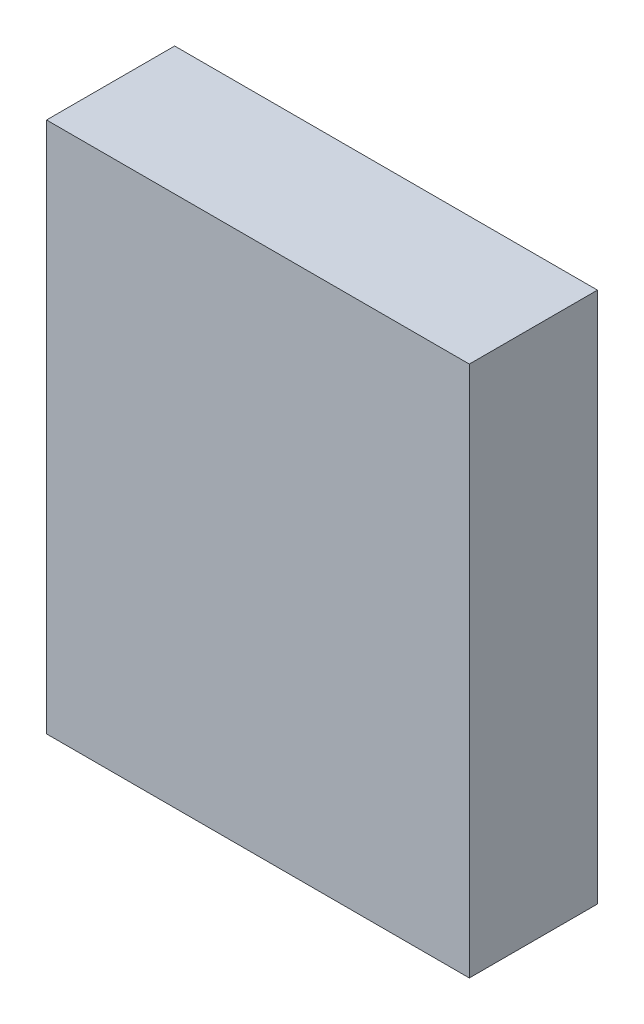
ISO-10303-21;
HEADER;
FILE_DESCRIPTION(('STEP AP214'),'2;1');
FILE_NAME('part.step','',(''),(''),'','','');
FILE_SCHEMA(('AUTOMOTIVE_DESIGN { 1 0 10303 214 1 1 1 1 }'));
ENDSEC;
DATA;
#1=APPLICATION_CONTEXT('core data for automotive mechanical design processes');
#2=APPLICATION_PROTOCOL_DEFINITION('international standard','automotive_design',2000,#1);
#3=PRODUCT_CONTEXT('',#1,'mechanical');
#4=PRODUCT('Part','Part','',(#3));
#5=PRODUCT_RELATED_PRODUCT_CATEGORY('part','',(#4));
#6=PRODUCT_DEFINITION_FORMATION('','',#4);
#7=PRODUCT_DEFINITION_CONTEXT('part definition',#1,'design');
#8=PRODUCT_DEFINITION('design','',#6,#7);
#9=PRODUCT_DEFINITION_SHAPE('','',#8);
#10=(LENGTH_UNIT() NAMED_UNIT(*) SI_UNIT(.MILLI.,.METRE.));
#11=(NAMED_UNIT(*) PLANE_ANGLE_UNIT() SI_UNIT($,.RADIAN.));
#12=(NAMED_UNIT(*) SI_UNIT($,.STERADIAN.) SOLID_ANGLE_UNIT());
#13=UNCERTAINTY_MEASURE_WITH_UNIT(LENGTH_MEASURE(1.E-05),#10,'distance_accuracy_value','');
#14=(GEOMETRIC_REPRESENTATION_CONTEXT(3) GLOBAL_UNCERTAINTY_ASSIGNED_CONTEXT((#13)) GLOBAL_UNIT_ASSIGNED_CONTEXT((#10,
#11,#12)) REPRESENTATION_CONTEXT('',''));
#15=CARTESIAN_POINT('',(0.,0.,0.));
#16=DIRECTION('',(0.,0.,1.));
#17=DIRECTION('',(1.,0.,0.));
#18=AXIS2_PLACEMENT_3D('',#15,#16,#17);
#19=CARTESIAN_POINT('',(0.,0.,2.));
#20=DIRECTION('',(0.,0.,1.));
#21=DIRECTION('',(1.,0.,0.));
#22=AXIS2_PLACEMENT_3D('',#19,#20,#21);
#23=PLANE('',#22);
#24=DIRECTION('',(0.,1.,0.));
#25=VECTOR('',#24,1.);
#26=CARTESIAN_POINT('',(0.,0.,2.));
#27=LINE('',#26,#25);
#28=CARTESIAN_POINT('',(0.,0.,2.));
#29=VERTEX_POINT('',#28);
#30=CARTESIAN_POINT('',(0.,8.3,2.));
#31=VERTEX_POINT('',#30);
#32=EDGE_CURVE('E90',#29,#31,#27,.T.);
#33=ORIENTED_EDGE('',*,*,#32,.F.);
#34=DIRECTION('',(1.,0.,0.));
#35=VECTOR('',#34,1.);
#36=CARTESIAN_POINT('',(0.,0.,2.));
#37=LINE('',#36,#35);
#38=CARTESIAN_POINT('',(6.6,0.,2.));
#39=VERTEX_POINT('',#38);
#40=EDGE_CURVE('E75',#29,#39,#37,.T.);
#41=ORIENTED_EDGE('',*,*,#40,.T.);
#42=DIRECTION('',(0.,1.,0.));
#43=VECTOR('',#42,1.);
#44=CARTESIAN_POINT('',(6.6,0.,2.));
#45=LINE('',#44,#43);
#46=CARTESIAN_POINT('',(6.6,8.3,2.));
#47=VERTEX_POINT('',#46);
#48=EDGE_CURVE('E83',#39,#47,#45,.T.);
#49=ORIENTED_EDGE('',*,*,#48,.T.);
#50=DIRECTION('',(1.,0.,0.));
#51=VECTOR('',#50,1.);
#52=CARTESIAN_POINT('',(0.,8.3,2.));
#53=LINE('',#52,#51);
#54=EDGE_CURVE('E11',#31,#47,#53,.T.);
#55=ORIENTED_EDGE('',*,*,#54,.F.);
#56=EDGE_LOOP('',(#33,#41,#49,#55));
#57=FACE_BOUND('',#56,.T.);
#58=ADVANCED_FACE('F17',(#57),#23,.T.);
#59=CARTESIAN_POINT('',(0.,0.,0.));
#60=DIRECTION('',(0.,0.,1.));
#61=DIRECTION('',(1.,0.,0.));
#62=AXIS2_PLACEMENT_3D('',#59,#60,#61);
#63=PLANE('',#62);
#64=DIRECTION('',(1.,0.,0.));
#65=VECTOR('',#64,1.);
#66=CARTESIAN_POINT('',(0.,8.3,0.));
#67=LINE('',#66,#65);
#68=CARTESIAN_POINT('',(0.,8.3,0.));
#69=VERTEX_POINT('',#68);
#70=CARTESIAN_POINT('',(6.6,8.3,0.));
#71=VERTEX_POINT('',#70);
#72=EDGE_CURVE('E27',#69,#71,#67,.T.);
#73=ORIENTED_EDGE('',*,*,#72,.T.);
#74=DIRECTION('',(0.,1.,0.));
#75=VECTOR('',#74,1.);
#76=CARTESIAN_POINT('',(6.6,0.,0.));
#77=LINE('',#76,#75);
#78=CARTESIAN_POINT('',(6.6,0.,0.));
#79=VERTEX_POINT('',#78);
#80=EDGE_CURVE('E110',#79,#71,#77,.T.);
#81=ORIENTED_EDGE('',*,*,#80,.F.);
#82=DIRECTION('',(1.,0.,0.));
#83=VECTOR('',#82,1.);
#84=CARTESIAN_POINT('',(0.,0.,0.));
#85=LINE('',#84,#83);
#86=CARTESIAN_POINT('',(0.,0.,0.));
#87=VERTEX_POINT('',#86);
#88=EDGE_CURVE('E85',#87,#79,#85,.T.);
#89=ORIENTED_EDGE('',*,*,#88,.F.);
#90=DIRECTION('',(0.,1.,0.));
#91=VECTOR('',#90,1.);
#92=CARTESIAN_POINT('',(0.,0.,0.));
#93=LINE('',#92,#91);
#94=EDGE_CURVE('E89',#87,#69,#93,.T.);
#95=ORIENTED_EDGE('',*,*,#94,.T.);
#96=EDGE_LOOP('',(#73,#81,#89,#95));
#97=FACE_BOUND('',#96,.T.);
#98=ADVANCED_FACE('F19',(#97),#63,.F.);
#99=CARTESIAN_POINT('',(0.,8.3,0.));
#100=DIRECTION('',(0.,1.,0.));
#101=DIRECTION('',(1.,0.,0.));
#102=AXIS2_PLACEMENT_3D('',#99,#100,#101);
#103=PLANE('',#102);
#104=ORIENTED_EDGE('',*,*,#72,.F.);
#105=DIRECTION('',(0.,0.,1.));
#106=VECTOR('',#105,1.);
#107=CARTESIAN_POINT('',(0.,8.3,0.));
#108=LINE('',#107,#106);
#109=EDGE_CURVE('E94',#69,#31,#108,.T.);
#110=ORIENTED_EDGE('',*,*,#109,.T.);
#111=ORIENTED_EDGE('',*,*,#54,.T.);
#112=DIRECTION('',(0.,0.,1.));
#113=VECTOR('',#112,1.);
#114=CARTESIAN_POINT('',(6.6,8.3,0.));
#115=LINE('',#114,#113);
#116=EDGE_CURVE('E101',#71,#47,#115,.T.);
#117=ORIENTED_EDGE('',*,*,#116,.F.);
#118=EDGE_LOOP('',(#104,#110,#111,#117));
#119=FACE_BOUND('',#118,.T.);
#120=ADVANCED_FACE('F118',(#119),#103,.T.);
#121=CARTESIAN_POINT('',(0.,0.,0.));
#122=DIRECTION('',(0.,1.,0.));
#123=DIRECTION('',(1.,0.,0.));
#124=AXIS2_PLACEMENT_3D('',#121,#122,#123);
#125=PLANE('',#124);
#126=DIRECTION('',(0.,0.,1.));
#127=VECTOR('',#126,1.);
#128=CARTESIAN_POINT('',(6.6,0.,0.));
#129=LINE('',#128,#127);
#130=EDGE_CURVE('E80',#79,#39,#129,.T.);
#131=ORIENTED_EDGE('',*,*,#130,.T.);
#132=ORIENTED_EDGE('',*,*,#40,.F.);
#133=DIRECTION('',(0.,0.,1.));
#134=VECTOR('',#133,1.);
#135=CARTESIAN_POINT('',(0.,0.,0.));
#136=LINE('',#135,#134);
#137=EDGE_CURVE('E72',#87,#29,#136,.T.);
#138=ORIENTED_EDGE('',*,*,#137,.F.);
#139=ORIENTED_EDGE('',*,*,#88,.T.);
#140=EDGE_LOOP('',(#131,#132,#138,#139));
#141=FACE_BOUND('',#140,.T.);
#142=ADVANCED_FACE('F73',(#141),#125,.F.);
#143=CARTESIAN_POINT('',(6.6,0.,0.));
#144=DIRECTION('',(1.,0.,0.));
#145=DIRECTION('',(0.,1.,0.));
#146=AXIS2_PLACEMENT_3D('',#143,#144,#145);
#147=PLANE('',#146);
#148=ORIENTED_EDGE('',*,*,#130,.F.);
#149=ORIENTED_EDGE('',*,*,#80,.T.);
#150=ORIENTED_EDGE('',*,*,#116,.T.);
#151=ORIENTED_EDGE('',*,*,#48,.F.);
#152=EDGE_LOOP('',(#148,#149,#150,#151));
#153=FACE_BOUND('',#152,.T.);
#154=ADVANCED_FACE('F119',(#153),#147,.T.);
#155=CARTESIAN_POINT('',(0.,0.,0.));
#156=DIRECTION('',(1.,0.,0.));
#157=DIRECTION('',(0.,1.,0.));
#158=AXIS2_PLACEMENT_3D('',#155,#156,#157);
#159=PLANE('',#158);
#160=ORIENTED_EDGE('',*,*,#32,.T.);
#161=ORIENTED_EDGE('',*,*,#109,.F.);
#162=ORIENTED_EDGE('',*,*,#94,.F.);
#163=ORIENTED_EDGE('',*,*,#137,.T.);
#164=EDGE_LOOP('',(#160,#161,#162,#163));
#165=FACE_BOUND('',#164,.T.);
#166=ADVANCED_FACE('F87',(#165),#159,.F.);
#167=CLOSED_SHELL('',(#58,#98,#120,#142,#154,#166));
#168=MANIFOLD_SOLID_BREP('B1',#167);
#169=ADVANCED_BREP_SHAPE_REPRESENTATION('',(#18,#168),#14);
#170=SHAPE_DEFINITION_REPRESENTATION(#9,#169);
ENDSEC;
END-ISO-10303-21;
